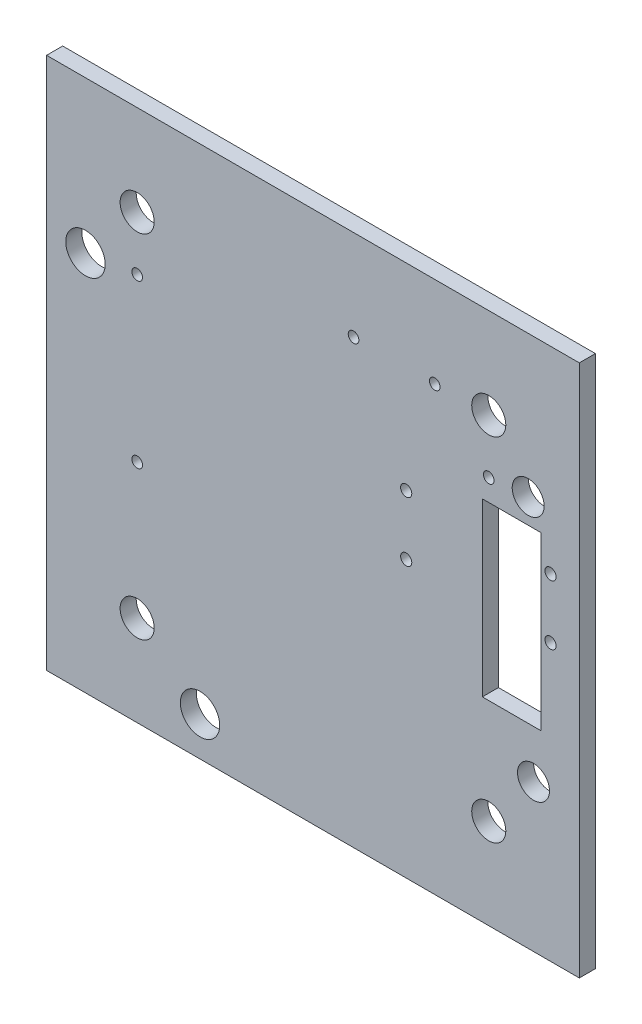
ISO-10303-21;
HEADER;
FILE_DESCRIPTION(('STEP AP214'),'2;1');
FILE_NAME('part.step','',(''),(''),'','','');
FILE_SCHEMA(('AUTOMOTIVE_DESIGN { 1 0 10303 214 1 1 1 1 }'));
ENDSEC;
DATA;
#1=APPLICATION_CONTEXT('core data for automotive mechanical design processes');
#2=APPLICATION_PROTOCOL_DEFINITION('international standard','automotive_design',2000,#1);
#3=PRODUCT_CONTEXT('',#1,'mechanical');
#4=PRODUCT('Part','Part','',(#3));
#5=PRODUCT_RELATED_PRODUCT_CATEGORY('part','',(#4));
#6=PRODUCT_DEFINITION_FORMATION('','',#4);
#7=PRODUCT_DEFINITION_CONTEXT('part definition',#1,'design');
#8=PRODUCT_DEFINITION('design','',#6,#7);
#9=PRODUCT_DEFINITION_SHAPE('','',#8);
#10=(LENGTH_UNIT() NAMED_UNIT(*) SI_UNIT(.MILLI.,.METRE.));
#11=(NAMED_UNIT(*) PLANE_ANGLE_UNIT() SI_UNIT($,.RADIAN.));
#12=(NAMED_UNIT(*) SI_UNIT($,.STERADIAN.) SOLID_ANGLE_UNIT());
#13=UNCERTAINTY_MEASURE_WITH_UNIT(LENGTH_MEASURE(1.E-05),#10,'distance_accuracy_value','');
#14=(GEOMETRIC_REPRESENTATION_CONTEXT(3) GLOBAL_UNCERTAINTY_ASSIGNED_CONTEXT((#13)) GLOBAL_UNIT_ASSIGNED_CONTEXT((#10,
#11,#12)) REPRESENTATION_CONTEXT('',''));
#15=CARTESIAN_POINT('',(0.,0.,0.));
#16=DIRECTION('',(0.,0.,1.));
#17=DIRECTION('',(1.,0.,0.));
#18=AXIS2_PLACEMENT_3D('',#15,#16,#17);
#19=CARTESIAN_POINT('',(16.244,41.774,-0.046));
#20=DIRECTION('',(0.,0.,-1.));
#21=DIRECTION('',(0.,-1.,0.));
#22=AXIS2_PLACEMENT_3D('',#19,#20,#21);
#23=CYLINDRICAL_SURFACE('',#22,1.6);
#24=CARTESIAN_POINT('',(16.244,41.774,0.));
#25=DIRECTION('',(0.,0.,-1.));
#26=DIRECTION('',(0.,-1.,0.));
#27=AXIS2_PLACEMENT_3D('',#24,#25,#26);
#28=CIRCLE('',#27,1.6);
#29=CARTESIAN_POINT('',(16.244,40.174,0.));
#30=VERTEX_POINT('',#29);
#31=EDGE_CURVE('E366',#30,#30,#28,.T.);
#32=ORIENTED_EDGE('',*,*,#31,.T.);
#33=DIRECTION('',(0.,0.,1.));
#34=VECTOR('',#33,1.);
#35=CARTESIAN_POINT('',(16.244,40.174,-0.046));
#36=LINE('',#35,#34);
#37=CARTESIAN_POINT('',(16.244,40.174,1.51));
#38=VERTEX_POINT('',#37);
#39=EDGE_CURVE('E11',#30,#38,#36,.T.);
#40=ORIENTED_EDGE('',*,*,#39,.T.);
#41=CARTESIAN_POINT('',(16.244,41.774,1.51));
#42=DIRECTION('',(0.,0.,-1.));
#43=DIRECTION('',(0.,-1.,0.));
#44=AXIS2_PLACEMENT_3D('',#41,#42,#43);
#45=CIRCLE('',#44,1.6);
#46=EDGE_CURVE('E334',#38,#38,#45,.T.);
#47=ORIENTED_EDGE('',*,*,#46,.F.);
#48=ORIENTED_EDGE('',*,*,#39,.F.);
#49=EDGE_LOOP('',(#32,#40,#47,#48));
#50=FACE_BOUND('',#49,.T.);
#51=ADVANCED_FACE('F47',(#50),#23,.F.);
#52=CARTESIAN_POINT('',(11.174,41.774,-0.046));
#53=DIRECTION('',(0.,0.,-1.));
#54=DIRECTION('',(0.,-1.,0.));
#55=AXIS2_PLACEMENT_3D('',#52,#53,#54);
#56=CYLINDRICAL_SURFACE('',#55,0.5);
#57=CARTESIAN_POINT('',(11.174,41.774,0.));
#58=DIRECTION('',(0.,0.,-1.));
#59=DIRECTION('',(0.,-1.,0.));
#60=AXIS2_PLACEMENT_3D('',#57,#58,#59);
#61=CIRCLE('',#60,0.5);
#62=CARTESIAN_POINT('',(11.174,41.274,0.));
#63=VERTEX_POINT('',#62);
#64=EDGE_CURVE('E415',#63,#63,#61,.T.);
#65=ORIENTED_EDGE('',*,*,#64,.T.);
#66=DIRECTION('',(0.,0.,1.));
#67=VECTOR('',#66,1.);
#68=CARTESIAN_POINT('',(11.174,41.274,-0.046));
#69=LINE('',#68,#67);
#70=CARTESIAN_POINT('',(11.174,41.274,1.51));
#71=VERTEX_POINT('',#70);
#72=EDGE_CURVE('E56',#63,#71,#69,.T.);
#73=ORIENTED_EDGE('',*,*,#72,.T.);
#74=CARTESIAN_POINT('',(11.174,41.774,1.51));
#75=DIRECTION('',(0.,0.,-1.));
#76=DIRECTION('',(0.,-1.,0.));
#77=AXIS2_PLACEMENT_3D('',#74,#75,#76);
#78=CIRCLE('',#77,0.5);
#79=EDGE_CURVE('E333',#71,#71,#78,.T.);
#80=ORIENTED_EDGE('',*,*,#79,.F.);
#81=ORIENTED_EDGE('',*,*,#72,.F.);
#82=EDGE_LOOP('',(#65,#73,#80,#81));
#83=FACE_BOUND('',#82,.T.);
#84=ADVANCED_FACE('F562',(#83),#56,.F.);
#85=CARTESIAN_POINT('',(19.944,36.974,0.));
#86=DIRECTION('',(0.,0.,-1.));
#87=DIRECTION('',(1.,0.,0.));
#88=AXIS2_PLACEMENT_3D('',#85,#86,#87);
#89=CYLINDRICAL_SURFACE('',#88,1.5);
#90=DIRECTION('',(0.,0.,1.));
#91=VECTOR('',#90,1.);
#92=CARTESIAN_POINT('',(21.444,36.974,0.));
#93=LINE('',#92,#91);
#94=CARTESIAN_POINT('',(21.444,36.974,0.));
#95=VERTEX_POINT('',#94);
#96=CARTESIAN_POINT('',(21.444,36.974,1.51));
#97=VERTEX_POINT('',#96);
#98=EDGE_CURVE('E50',#95,#97,#93,.T.);
#99=ORIENTED_EDGE('',*,*,#98,.T.);
#100=CARTESIAN_POINT('',(19.944,36.974,1.51));
#101=DIRECTION('',(0.,0.,1.));
#102=DIRECTION('',(1.,0.,0.));
#103=AXIS2_PLACEMENT_3D('',#100,#101,#102);
#104=CIRCLE('',#103,1.5);
#105=EDGE_CURVE('E330',#97,#97,#104,.T.);
#106=ORIENTED_EDGE('',*,*,#105,.T.);
#107=ORIENTED_EDGE('',*,*,#98,.F.);
#108=CARTESIAN_POINT('',(19.944,36.974,0.));
#109=DIRECTION('',(0.,0.,1.));
#110=DIRECTION('',(1.,0.,0.));
#111=AXIS2_PLACEMENT_3D('',#108,#109,#110);
#112=CIRCLE('',#111,1.5);
#113=EDGE_CURVE('E411',#95,#95,#112,.T.);
#114=ORIENTED_EDGE('',*,*,#113,.F.);
#115=EDGE_LOOP('',(#99,#106,#107,#114));
#116=FACE_BOUND('',#115,.T.);
#117=ADVANCED_FACE('F566',(#116),#89,.F.);
#118=CARTESIAN_POINT('',(16.244,36.704,-0.046));
#119=DIRECTION('',(0.,0.,-1.));
#120=DIRECTION('',(0.,-1.,0.));
#121=AXIS2_PLACEMENT_3D('',#118,#119,#120);
#122=CYLINDRICAL_SURFACE('',#121,0.5);
#123=CARTESIAN_POINT('',(16.244,36.704,0.));
#124=DIRECTION('',(0.,0.,-1.));
#125=DIRECTION('',(0.,-1.,0.));
#126=AXIS2_PLACEMENT_3D('',#123,#124,#125);
#127=CIRCLE('',#126,0.5);
#128=CARTESIAN_POINT('',(16.244,36.204,0.));
#129=VERTEX_POINT('',#128);
#130=EDGE_CURVE('E408',#129,#129,#127,.T.);
#131=ORIENTED_EDGE('',*,*,#130,.T.);
#132=DIRECTION('',(0.,0.,1.));
#133=VECTOR('',#132,1.);
#134=CARTESIAN_POINT('',(16.244,36.204,-0.046));
#135=LINE('',#134,#133);
#136=CARTESIAN_POINT('',(16.244,36.204,1.51));
#137=VERTEX_POINT('',#136);
#138=EDGE_CURVE('E271',#129,#137,#135,.T.);
#139=ORIENTED_EDGE('',*,*,#138,.T.);
#140=CARTESIAN_POINT('',(16.244,36.704,1.51));
#141=DIRECTION('',(0.,0.,-1.));
#142=DIRECTION('',(0.,-1.,0.));
#143=AXIS2_PLACEMENT_3D('',#140,#141,#142);
#144=CIRCLE('',#143,0.5);
#145=EDGE_CURVE('E327',#137,#137,#144,.T.);
#146=ORIENTED_EDGE('',*,*,#145,.F.);
#147=ORIENTED_EDGE('',*,*,#138,.F.);
#148=EDGE_LOOP('',(#131,#139,#146,#147));
#149=FACE_BOUND('',#148,.T.);
#150=ADVANCED_FACE('F570',(#149),#122,.F.);
#151=CARTESIAN_POINT('',(3.554,41.774,-0.046));
#152=DIRECTION('',(0.,0.,-1.));
#153=DIRECTION('',(0.,-1.,0.));
#154=AXIS2_PLACEMENT_3D('',#151,#152,#153);
#155=CYLINDRICAL_SURFACE('',#154,0.5);
#156=CARTESIAN_POINT('',(3.554,41.774,0.));
#157=DIRECTION('',(0.,0.,-1.));
#158=DIRECTION('',(0.,-1.,0.));
#159=AXIS2_PLACEMENT_3D('',#156,#157,#158);
#160=CIRCLE('',#159,0.5);
#161=CARTESIAN_POINT('',(3.554,41.274,0.));
#162=VERTEX_POINT('',#161);
#163=EDGE_CURVE('E403',#162,#162,#160,.T.);
#164=ORIENTED_EDGE('',*,*,#163,.T.);
#165=DIRECTION('',(0.,0.,1.));
#166=VECTOR('',#165,1.);
#167=CARTESIAN_POINT('',(3.554,41.274,-0.046));
#168=LINE('',#167,#166);
#169=CARTESIAN_POINT('',(3.554,41.274,1.51));
#170=VERTEX_POINT('',#169);
#171=EDGE_CURVE('E269',#162,#170,#168,.T.);
#172=ORIENTED_EDGE('',*,*,#171,.T.);
#173=CARTESIAN_POINT('',(3.554,41.774,1.51));
#174=DIRECTION('',(0.,0.,-1.));
#175=DIRECTION('',(0.,-1.,0.));
#176=AXIS2_PLACEMENT_3D('',#173,#174,#175);
#177=CIRCLE('',#176,0.5);
#178=EDGE_CURVE('E323',#170,#170,#177,.T.);
#179=ORIENTED_EDGE('',*,*,#178,.F.);
#180=ORIENTED_EDGE('',*,*,#171,.F.);
#181=EDGE_LOOP('',(#164,#172,#179,#180));
#182=FACE_BOUND('',#181,.T.);
#183=ADVANCED_FACE('F575',(#182),#155,.F.);
#184=CARTESIAN_POINT('',(21.144,34.674,0.));
#185=DIRECTION('',(0.,-1.,0.));
#186=DIRECTION('',(0.,0.,-1.));
#187=AXIS2_PLACEMENT_3D('',#184,#185,#186);
#188=PLANE('',#187);
#189=DIRECTION('',(0.,0.,1.));
#190=VECTOR('',#189,1.);
#191=CARTESIAN_POINT('',(21.144,34.674,0.));
#192=LINE('',#191,#190);
#193=CARTESIAN_POINT('',(21.144,34.674,0.));
#194=VERTEX_POINT('',#193);
#195=CARTESIAN_POINT('',(21.144,34.674,1.51));
#196=VERTEX_POINT('',#195);
#197=EDGE_CURVE('E268',#194,#196,#192,.T.);
#198=ORIENTED_EDGE('',*,*,#197,.T.);
#199=DIRECTION('',(-1.,0.,0.));
#200=VECTOR('',#199,1.);
#201=CARTESIAN_POINT('',(21.144,34.674,1.51));
#202=LINE('',#201,#200);
#203=CARTESIAN_POINT('',(15.644,34.674,1.51));
#204=VERTEX_POINT('',#203);
#205=EDGE_CURVE('E315',#196,#204,#202,.T.);
#206=ORIENTED_EDGE('',*,*,#205,.T.);
#207=DIRECTION('',(0.,0.,1.));
#208=VECTOR('',#207,1.);
#209=CARTESIAN_POINT('',(15.644,34.674,0.));
#210=LINE('',#209,#208);
#211=CARTESIAN_POINT('',(15.644,34.674,0.));
#212=VERTEX_POINT('',#211);
#213=EDGE_CURVE('E265',#212,#204,#210,.T.);
#214=ORIENTED_EDGE('',*,*,#213,.F.);
#215=DIRECTION('',(-1.,0.,0.));
#216=VECTOR('',#215,1.);
#217=CARTESIAN_POINT('',(21.144,34.674,0.));
#218=LINE('',#217,#216);
#219=EDGE_CURVE('E379',#194,#212,#218,.T.);
#220=ORIENTED_EDGE('',*,*,#219,.F.);
#221=EDGE_LOOP('',(#198,#206,#214,#220));
#222=FACE_BOUND('',#221,.T.);
#223=ADVANCED_FACE('F578',(#222),#188,.T.);
#224=CARTESIAN_POINT('',(21.144,18.574,0.));
#225=DIRECTION('',(-1.,0.,0.));
#226=DIRECTION('',(0.,0.,1.));
#227=AXIS2_PLACEMENT_3D('',#224,#225,#226);
#228=PLANE('',#227);
#229=DIRECTION('',(0.,0.,1.));
#230=VECTOR('',#229,1.);
#231=CARTESIAN_POINT('',(21.144,18.574,0.));
#232=LINE('',#231,#230);
#233=CARTESIAN_POINT('',(21.144,18.574,0.));
#234=VERTEX_POINT('',#233);
#235=CARTESIAN_POINT('',(21.144,18.574,1.51));
#236=VERTEX_POINT('',#235);
#237=EDGE_CURVE('E262',#234,#236,#232,.T.);
#238=ORIENTED_EDGE('',*,*,#237,.T.);
#239=DIRECTION('',(0.,1.,0.));
#240=VECTOR('',#239,1.);
#241=CARTESIAN_POINT('',(21.144,18.574,1.51));
#242=LINE('',#241,#240);
#243=EDGE_CURVE('E319',#236,#196,#242,.T.);
#244=ORIENTED_EDGE('',*,*,#243,.T.);
#245=ORIENTED_EDGE('',*,*,#197,.F.);
#246=DIRECTION('',(0.,1.,0.));
#247=VECTOR('',#246,1.);
#248=CARTESIAN_POINT('',(21.144,18.574,0.));
#249=LINE('',#248,#247);
#250=EDGE_CURVE('E384',#234,#194,#249,.T.);
#251=ORIENTED_EDGE('',*,*,#250,.F.);
#252=EDGE_LOOP('',(#238,#244,#245,#251));
#253=FACE_BOUND('',#252,.T.);
#254=ADVANCED_FACE('F582',(#253),#228,.T.);
#255=CARTESIAN_POINT('',(15.644,34.674,0.));
#256=DIRECTION('',(1.,0.,0.));
#257=DIRECTION('',(0.,1.,0.));
#258=AXIS2_PLACEMENT_3D('',#255,#256,#257);
#259=PLANE('',#258);
#260=ORIENTED_EDGE('',*,*,#213,.T.);
#261=DIRECTION('',(0.,-1.,0.));
#262=VECTOR('',#261,1.);
#263=CARTESIAN_POINT('',(15.644,34.674,1.51));
#264=LINE('',#263,#262);
#265=CARTESIAN_POINT('',(15.644,18.574,1.51));
#266=VERTEX_POINT('',#265);
#267=EDGE_CURVE('E311',#204,#266,#264,.T.);
#268=ORIENTED_EDGE('',*,*,#267,.T.);
#269=DIRECTION('',(0.,0.,1.));
#270=VECTOR('',#269,1.);
#271=CARTESIAN_POINT('',(15.644,18.574,0.));
#272=LINE('',#271,#270);
#273=CARTESIAN_POINT('',(15.644,18.574,0.));
#274=VERTEX_POINT('',#273);
#275=EDGE_CURVE('E251',#274,#266,#272,.T.);
#276=ORIENTED_EDGE('',*,*,#275,.F.);
#277=DIRECTION('',(0.,-1.,0.));
#278=VECTOR('',#277,1.);
#279=CARTESIAN_POINT('',(15.644,34.674,0.));
#280=LINE('',#279,#278);
#281=EDGE_CURVE('E383',#212,#274,#280,.T.);
#282=ORIENTED_EDGE('',*,*,#281,.F.);
#283=EDGE_LOOP('',(#260,#268,#276,#282));
#284=FACE_BOUND('',#283,.T.);
#285=ADVANCED_FACE('F586',(#284),#259,.T.);
#286=CARTESIAN_POINT('',(15.644,18.574,0.));
#287=DIRECTION('',(0.,1.,0.));
#288=DIRECTION('',(1.,0.,0.));
#289=AXIS2_PLACEMENT_3D('',#286,#287,#288);
#290=PLANE('',#289);
#291=ORIENTED_EDGE('',*,*,#275,.T.);
#292=DIRECTION('',(1.,0.,0.));
#293=VECTOR('',#292,1.);
#294=CARTESIAN_POINT('',(15.644,18.574,1.51));
#295=LINE('',#294,#293);
#296=EDGE_CURVE('E307',#266,#236,#295,.T.);
#297=ORIENTED_EDGE('',*,*,#296,.T.);
#298=ORIENTED_EDGE('',*,*,#237,.F.);
#299=DIRECTION('',(1.,0.,0.));
#300=VECTOR('',#299,1.);
#301=CARTESIAN_POINT('',(15.644,18.574,0.));
#302=LINE('',#301,#300);
#303=EDGE_CURVE('E400',#274,#234,#302,.T.);
#304=ORIENTED_EDGE('',*,*,#303,.F.);
#305=EDGE_LOOP('',(#291,#297,#298,#304));
#306=FACE_BOUND('',#305,.T.);
#307=ADVANCED_FACE('F590',(#306),#290,.T.);
#308=CARTESIAN_POINT('',(-16.756,41.774,-0.046));
#309=DIRECTION('',(0.,0.,-1.));
#310=DIRECTION('',(0.,-1.,0.));
#311=AXIS2_PLACEMENT_3D('',#308,#309,#310);
#312=CYLINDRICAL_SURFACE('',#311,1.6);
#313=CARTESIAN_POINT('',(-16.756,41.774,0.));
#314=DIRECTION('',(0.,0.,-1.));
#315=DIRECTION('',(0.,-1.,0.));
#316=AXIS2_PLACEMENT_3D('',#313,#314,#315);
#317=CIRCLE('',#316,1.6);
#318=CARTESIAN_POINT('',(-16.756,40.174,0.));
#319=VERTEX_POINT('',#318);
#320=EDGE_CURVE('E387',#319,#319,#317,.T.);
#321=ORIENTED_EDGE('',*,*,#320,.T.);
#322=DIRECTION('',(0.,0.,1.));
#323=VECTOR('',#322,1.);
#324=CARTESIAN_POINT('',(-16.756,40.174,-0.046));
#325=LINE('',#324,#323);
#326=CARTESIAN_POINT('',(-16.756,40.174,1.51));
#327=VERTEX_POINT('',#326);
#328=EDGE_CURVE('E245',#319,#327,#325,.T.);
#329=ORIENTED_EDGE('',*,*,#328,.T.);
#330=CARTESIAN_POINT('',(-16.756,41.774,1.51));
#331=DIRECTION('',(0.,0.,-1.));
#332=DIRECTION('',(0.,-1.,0.));
#333=AXIS2_PLACEMENT_3D('',#330,#331,#332);
#334=CIRCLE('',#333,1.6);
#335=EDGE_CURVE('E306',#327,#327,#334,.T.);
#336=ORIENTED_EDGE('',*,*,#335,.F.);
#337=ORIENTED_EDGE('',*,*,#328,.F.);
#338=EDGE_LOOP('',(#321,#329,#336,#337));
#339=FACE_BOUND('',#338,.T.);
#340=ADVANCED_FACE('F594',(#339),#312,.F.);
#341=CARTESIAN_POINT('',(-16.756,36.704,-0.046));
#342=DIRECTION('',(0.,0.,-1.));
#343=DIRECTION('',(0.,-1.,0.));
#344=AXIS2_PLACEMENT_3D('',#341,#342,#343);
#345=CYLINDRICAL_SURFACE('',#344,0.5);
#346=CARTESIAN_POINT('',(-16.756,36.704,0.));
#347=DIRECTION('',(0.,0.,-1.));
#348=DIRECTION('',(0.,-1.,0.));
#349=AXIS2_PLACEMENT_3D('',#346,#347,#348);
#350=CIRCLE('',#349,0.5);
#351=CARTESIAN_POINT('',(-16.756,36.204,0.));
#352=VERTEX_POINT('',#351);
#353=EDGE_CURVE('E241',#352,#352,#350,.T.);
#354=ORIENTED_EDGE('',*,*,#353,.T.);
#355=DIRECTION('',(0.,0.,1.));
#356=VECTOR('',#355,1.);
#357=CARTESIAN_POINT('',(-16.756,36.204,-0.046));
#358=LINE('',#357,#356);
#359=CARTESIAN_POINT('',(-16.756,36.204,1.51));
#360=VERTEX_POINT('',#359);
#361=EDGE_CURVE('E238',#352,#360,#358,.T.);
#362=ORIENTED_EDGE('',*,*,#361,.T.);
#363=CARTESIAN_POINT('',(-16.756,36.704,1.51));
#364=DIRECTION('',(0.,0.,-1.));
#365=DIRECTION('',(0.,-1.,0.));
#366=AXIS2_PLACEMENT_3D('',#363,#364,#365);
#367=CIRCLE('',#366,0.5);
#368=EDGE_CURVE('E243',#360,#360,#367,.T.);
#369=ORIENTED_EDGE('',*,*,#368,.F.);
#370=ORIENTED_EDGE('',*,*,#361,.F.);
#371=EDGE_LOOP('',(#354,#362,#369,#370));
#372=FACE_BOUND('',#371,.T.);
#373=ADVANCED_FACE('F239',(#372),#345,.F.);
#374=CARTESIAN_POINT('',(-21.606,36.024,0.));
#375=DIRECTION('',(0.,0.,-1.));
#376=DIRECTION('',(1.,0.,0.));
#377=AXIS2_PLACEMENT_3D('',#374,#375,#376);
#378=CYLINDRICAL_SURFACE('',#377,1.85);
#379=DIRECTION('',(0.,0.,1.));
#380=VECTOR('',#379,1.);
#381=CARTESIAN_POINT('',(-19.756,36.024,0.));
#382=LINE('',#381,#380);
#383=CARTESIAN_POINT('',(-19.756,36.024,0.));
#384=VERTEX_POINT('',#383);
#385=CARTESIAN_POINT('',(-19.756,36.024,1.51));
#386=VERTEX_POINT('',#385);
#387=EDGE_CURVE('E246',#384,#386,#382,.T.);
#388=ORIENTED_EDGE('',*,*,#387,.T.);
#389=CARTESIAN_POINT('',(-21.606,36.024,1.51));
#390=DIRECTION('',(0.,0.,1.));
#391=DIRECTION('',(1.,0.,0.));
#392=AXIS2_PLACEMENT_3D('',#389,#390,#391);
#393=CIRCLE('',#392,1.85);
#394=EDGE_CURVE('E300',#386,#386,#393,.T.);
#395=ORIENTED_EDGE('',*,*,#394,.T.);
#396=ORIENTED_EDGE('',*,*,#387,.F.);
#397=CARTESIAN_POINT('',(-21.606,36.024,0.));
#398=DIRECTION('',(0.,0.,1.));
#399=DIRECTION('',(1.,0.,0.));
#400=AXIS2_PLACEMENT_3D('',#397,#398,#399);
#401=CIRCLE('',#400,1.85);
#402=EDGE_CURVE('E375',#384,#384,#401,.T.);
#403=ORIENTED_EDGE('',*,*,#402,.F.);
#404=EDGE_LOOP('',(#388,#395,#396,#403));
#405=FACE_BOUND('',#404,.T.);
#406=ADVANCED_FACE('F601',(#405),#378,.F.);
#407=CARTESIAN_POINT('',(20.444,14.074,0.));
#408=DIRECTION('',(0.,0.,-1.));
#409=DIRECTION('',(1.,0.,0.));
#410=AXIS2_PLACEMENT_3D('',#407,#408,#409);
#411=CYLINDRICAL_SURFACE('',#410,1.5);
#412=DIRECTION('',(0.,0.,1.));
#413=VECTOR('',#412,1.);
#414=CARTESIAN_POINT('',(21.944,14.074,0.));
#415=LINE('',#414,#413);
#416=CARTESIAN_POINT('',(21.944,14.074,0.));
#417=VERTEX_POINT('',#416);
#418=CARTESIAN_POINT('',(21.944,14.074,1.51));
#419=VERTEX_POINT('',#418);
#420=EDGE_CURVE('E254',#417,#419,#415,.T.);
#421=ORIENTED_EDGE('',*,*,#420,.T.);
#422=CARTESIAN_POINT('',(20.444,14.074,1.51));
#423=DIRECTION('',(0.,0.,1.));
#424=DIRECTION('',(1.,0.,0.));
#425=AXIS2_PLACEMENT_3D('',#422,#423,#424);
#426=CIRCLE('',#425,1.5);
#427=EDGE_CURVE('E299',#419,#419,#426,.T.);
#428=ORIENTED_EDGE('',*,*,#427,.T.);
#429=ORIENTED_EDGE('',*,*,#420,.F.);
#430=CARTESIAN_POINT('',(20.444,14.074,0.));
#431=DIRECTION('',(0.,0.,1.));
#432=DIRECTION('',(1.,0.,0.));
#433=AXIS2_PLACEMENT_3D('',#430,#431,#432);
#434=CIRCLE('',#433,1.5);
#435=EDGE_CURVE('E370',#417,#417,#434,.T.);
#436=ORIENTED_EDGE('',*,*,#435,.F.);
#437=EDGE_LOOP('',(#421,#428,#429,#436));
#438=FACE_BOUND('',#437,.T.);
#439=ADVANCED_FACE('F539',(#438),#411,.F.);
#440=CARTESIAN_POINT('',(16.244,8.774,-0.046));
#441=DIRECTION('',(0.,0.,-1.));
#442=DIRECTION('',(0.,-1.,0.));
#443=AXIS2_PLACEMENT_3D('',#440,#441,#442);
#444=CYLINDRICAL_SURFACE('',#443,1.6);
#445=CARTESIAN_POINT('',(16.244,8.774,0.));
#446=DIRECTION('',(0.,0.,-1.));
#447=DIRECTION('',(0.,-1.,0.));
#448=AXIS2_PLACEMENT_3D('',#445,#446,#447);
#449=CIRCLE('',#448,1.6);
#450=CARTESIAN_POINT('',(16.244,7.174,0.));
#451=VERTEX_POINT('',#450);
#452=EDGE_CURVE('E367',#451,#451,#449,.T.);
#453=ORIENTED_EDGE('',*,*,#452,.T.);
#454=DIRECTION('',(0.,0.,1.));
#455=VECTOR('',#454,1.);
#456=CARTESIAN_POINT('',(16.244,7.174,-0.046));
#457=LINE('',#456,#455);
#458=CARTESIAN_POINT('',(16.244,7.174,1.51));
#459=VERTEX_POINT('',#458);
#460=EDGE_CURVE('E345',#451,#459,#457,.T.);
#461=ORIENTED_EDGE('',*,*,#460,.T.);
#462=CARTESIAN_POINT('',(16.244,8.774,1.51));
#463=DIRECTION('',(0.,0.,-1.));
#464=DIRECTION('',(0.,-1.,0.));
#465=AXIS2_PLACEMENT_3D('',#462,#463,#464);
#466=CIRCLE('',#465,1.6);
#467=EDGE_CURVE('E295',#459,#459,#466,.T.);
#468=ORIENTED_EDGE('',*,*,#467,.F.);
#469=ORIENTED_EDGE('',*,*,#460,.F.);
#470=EDGE_LOOP('',(#453,#461,#468,#469));
#471=FACE_BOUND('',#470,.T.);
#472=ADVANCED_FACE('F604',(#471),#444,.F.);
#473=CARTESIAN_POINT('',(-16.756,21.4615,-0.046));
#474=DIRECTION('',(0.,0.,-1.));
#475=DIRECTION('',(0.,-1.,0.));
#476=AXIS2_PLACEMENT_3D('',#473,#474,#475);
#477=CYLINDRICAL_SURFACE('',#476,0.5);
#478=CARTESIAN_POINT('',(-16.756,21.4615,0.));
#479=DIRECTION('',(0.,0.,-1.));
#480=DIRECTION('',(0.,-1.,0.));
#481=AXIS2_PLACEMENT_3D('',#478,#479,#480);
#482=CIRCLE('',#481,0.5);
#483=CARTESIAN_POINT('',(-16.756,20.9615,0.));
#484=VERTEX_POINT('',#483);
#485=EDGE_CURVE('E371',#484,#484,#482,.T.);
#486=ORIENTED_EDGE('',*,*,#485,.T.);
#487=DIRECTION('',(0.,0.,1.));
#488=VECTOR('',#487,1.);
#489=CARTESIAN_POINT('',(-16.756,20.9615,-0.046));
#490=LINE('',#489,#488);
#491=CARTESIAN_POINT('',(-16.756,20.9615,1.51));
#492=VERTEX_POINT('',#491);
#493=EDGE_CURVE('E257',#484,#492,#490,.T.);
#494=ORIENTED_EDGE('',*,*,#493,.T.);
#495=CARTESIAN_POINT('',(-16.756,21.4615,1.51));
#496=DIRECTION('',(0.,0.,-1.));
#497=DIRECTION('',(0.,-1.,0.));
#498=AXIS2_PLACEMENT_3D('',#495,#496,#497);
#499=CIRCLE('',#498,0.5);
#500=EDGE_CURVE('E292',#492,#492,#499,.T.);
#501=ORIENTED_EDGE('',*,*,#500,.F.);
#502=ORIENTED_EDGE('',*,*,#493,.F.);
#503=EDGE_LOOP('',(#486,#494,#501,#502));
#504=FACE_BOUND('',#503,.T.);
#505=ADVANCED_FACE('F607',(#504),#477,.F.);
#506=CARTESIAN_POINT('',(-10.856,3.924,0.));
#507=DIRECTION('',(0.,0.,-1.));
#508=DIRECTION('',(1.,0.,0.));
#509=AXIS2_PLACEMENT_3D('',#506,#507,#508);
#510=CYLINDRICAL_SURFACE('',#509,1.85);
#511=DIRECTION('',(0.,0.,1.));
#512=VECTOR('',#511,1.);
#513=CARTESIAN_POINT('',(-9.006,3.924,0.));
#514=LINE('',#513,#512);
#515=CARTESIAN_POINT('',(-9.006,3.924,0.));
#516=VERTEX_POINT('',#515);
#517=CARTESIAN_POINT('',(-9.006,3.924,1.51));
#518=VERTEX_POINT('',#517);
#519=EDGE_CURVE('E339',#516,#518,#514,.T.);
#520=ORIENTED_EDGE('',*,*,#519,.T.);
#521=CARTESIAN_POINT('',(-10.856,3.924,1.51));
#522=DIRECTION('',(0.,0.,1.));
#523=DIRECTION('',(1.,0.,0.));
#524=AXIS2_PLACEMENT_3D('',#521,#522,#523);
#525=CIRCLE('',#524,1.85);
#526=EDGE_CURVE('E291',#518,#518,#525,.T.);
#527=ORIENTED_EDGE('',*,*,#526,.T.);
#528=ORIENTED_EDGE('',*,*,#519,.F.);
#529=CARTESIAN_POINT('',(-10.856,3.924,0.));
#530=DIRECTION('',(0.,0.,1.));
#531=DIRECTION('',(1.,0.,0.));
#532=AXIS2_PLACEMENT_3D('',#529,#530,#531);
#533=CIRCLE('',#532,1.85);
#534=EDGE_CURVE('E454',#516,#516,#533,.T.);
#535=ORIENTED_EDGE('',*,*,#534,.F.);
#536=EDGE_LOOP('',(#520,#527,#528,#535));
#537=FACE_BOUND('',#536,.T.);
#538=ADVANCED_FACE('F558',(#537),#510,.F.);
#539=CARTESIAN_POINT('',(-16.756,8.774,-0.046));
#540=DIRECTION('',(0.,0.,-1.));
#541=DIRECTION('',(0.,-1.,0.));
#542=AXIS2_PLACEMENT_3D('',#539,#540,#541);
#543=CYLINDRICAL_SURFACE('',#542,1.6);
#544=CARTESIAN_POINT('',(-16.756,8.774,0.));
#545=DIRECTION('',(0.,0.,-1.));
#546=DIRECTION('',(0.,-1.,0.));
#547=AXIS2_PLACEMENT_3D('',#544,#545,#546);
#548=CIRCLE('',#547,1.6);
#549=CARTESIAN_POINT('',(-16.756,7.174,0.));
#550=VERTEX_POINT('',#549);
#551=EDGE_CURVE('E362',#550,#550,#548,.T.);
#552=ORIENTED_EDGE('',*,*,#551,.T.);
#553=DIRECTION('',(0.,0.,1.));
#554=VECTOR('',#553,1.);
#555=CARTESIAN_POINT('',(-16.756,7.174,-0.046));
#556=LINE('',#555,#554);
#557=CARTESIAN_POINT('',(-16.756,7.174,1.51));
#558=VERTEX_POINT('',#557);
#559=EDGE_CURVE('E337',#550,#558,#556,.T.);
#560=ORIENTED_EDGE('',*,*,#559,.T.);
#561=CARTESIAN_POINT('',(-16.756,8.774,1.51));
#562=DIRECTION('',(0.,0.,-1.));
#563=DIRECTION('',(0.,-1.,0.));
#564=AXIS2_PLACEMENT_3D('',#561,#562,#563);
#565=CIRCLE('',#564,1.6);
#566=EDGE_CURVE('E365',#558,#558,#565,.T.);
#567=ORIENTED_EDGE('',*,*,#566,.F.);
#568=ORIENTED_EDGE('',*,*,#559,.F.);
#569=EDGE_LOOP('',(#552,#560,#567,#568));
#570=FACE_BOUND('',#569,.T.);
#571=ADVANCED_FACE('F553',(#570),#543,.F.);
#572=CARTESIAN_POINT('',(-25.256,50.274,0.));
#573=DIRECTION('',(0.,1.,0.));
#574=DIRECTION('',(1.,0.,0.));
#575=AXIS2_PLACEMENT_3D('',#572,#573,#574);
#576=PLANE('',#575);
#577=DIRECTION('',(0.,0.,1.));
#578=VECTOR('',#577,1.);
#579=CARTESIAN_POINT('',(-25.256,50.274,0.));
#580=LINE('',#579,#578);
#581=CARTESIAN_POINT('',(-25.256,50.274,0.));
#582=VERTEX_POINT('',#581);
#583=CARTESIAN_POINT('',(-25.256,50.274,1.51));
#584=VERTEX_POINT('',#583);
#585=EDGE_CURVE('E470',#582,#584,#580,.T.);
#586=ORIENTED_EDGE('',*,*,#585,.T.);
#587=DIRECTION('',(1.,0.,0.));
#588=VECTOR('',#587,1.);
#589=CARTESIAN_POINT('',(-25.256,50.274,1.51));
#590=LINE('',#589,#588);
#591=CARTESIAN_POINT('',(24.744,50.274,1.51));
#592=VERTEX_POINT('',#591);
#593=EDGE_CURVE('E363',#584,#592,#590,.T.);
#594=ORIENTED_EDGE('',*,*,#593,.T.);
#595=DIRECTION('',(0.,0.,1.));
#596=VECTOR('',#595,1.);
#597=CARTESIAN_POINT('',(24.744,50.274,0.));
#598=LINE('',#597,#596);
#599=CARTESIAN_POINT('',(24.744,50.274,0.));
#600=VERTEX_POINT('',#599);
#601=EDGE_CURVE('E500',#600,#592,#598,.T.);
#602=ORIENTED_EDGE('',*,*,#601,.F.);
#603=DIRECTION('',(1.,0.,0.));
#604=VECTOR('',#603,1.);
#605=CARTESIAN_POINT('',(-25.256,50.274,0.));
#606=LINE('',#605,#604);
#607=EDGE_CURVE('E462',#582,#600,#606,.T.);
#608=ORIENTED_EDGE('',*,*,#607,.F.);
#609=EDGE_LOOP('',(#586,#594,#602,#608));
#610=FACE_BOUND('',#609,.T.);
#611=ADVANCED_FACE('F543',(#610),#576,.T.);
#612=CARTESIAN_POINT('',(0.,0.,1.51));
#613=DIRECTION('',(0.,0.,1.));
#614=DIRECTION('',(1.,0.,0.));
#615=AXIS2_PLACEMENT_3D('',#612,#613,#614);
#616=PLANE('',#615);
#617=CARTESIAN_POINT('',(22.044,26.174,1.51));
#618=DIRECTION('',(0.,0.,1.));
#619=DIRECTION('',(1.,0.,0.));
#620=AXIS2_PLACEMENT_3D('',#617,#618,#619);
#621=CIRCLE('',#620,0.524999999999997);
#622=CARTESIAN_POINT('',(22.569,26.174,1.51));
#623=VERTEX_POINT('',#622);
#624=EDGE_CURVE('E666',#623,#623,#621,.T.);
#625=ORIENTED_EDGE('',*,*,#624,.F.);
#626=EDGE_LOOP('',(#625));
#627=FACE_BOUND('',#626,.T.);
#628=CARTESIAN_POINT('',(8.494,26.174,1.51));
#629=DIRECTION('',(0.,0.,1.));
#630=DIRECTION('',(1.,0.,0.));
#631=AXIS2_PLACEMENT_3D('',#628,#629,#630);
#632=CIRCLE('',#631,0.524999999999997);
#633=CARTESIAN_POINT('',(9.01899999999999,26.174,1.51));
#634=VERTEX_POINT('',#633);
#635=EDGE_CURVE('E660',#634,#634,#632,.T.);
#636=ORIENTED_EDGE('',*,*,#635,.F.);
#637=EDGE_LOOP('',(#636));
#638=FACE_BOUND('',#637,.T.);
#639=CARTESIAN_POINT('',(8.494,31.774,1.51));
#640=DIRECTION('',(0.,0.,1.));
#641=DIRECTION('',(1.,0.,0.));
#642=AXIS2_PLACEMENT_3D('',#639,#640,#641);
#643=CIRCLE('',#642,0.524999999999997);
#644=CARTESIAN_POINT('',(9.01899999999999,31.774,1.51));
#645=VERTEX_POINT('',#644);
#646=EDGE_CURVE('E648',#645,#645,#643,.T.);
#647=ORIENTED_EDGE('',*,*,#646,.F.);
#648=EDGE_LOOP('',(#647));
#649=FACE_BOUND('',#648,.T.);
#650=CARTESIAN_POINT('',(22.044,31.774,1.51));
#651=DIRECTION('',(0.,0.,1.));
#652=DIRECTION('',(1.,0.,0.));
#653=AXIS2_PLACEMENT_3D('',#650,#651,#652);
#654=CIRCLE('',#653,0.524999999999997);
#655=CARTESIAN_POINT('',(22.569,31.774,1.51));
#656=VERTEX_POINT('',#655);
#657=EDGE_CURVE('E523',#656,#656,#654,.T.);
#658=ORIENTED_EDGE('',*,*,#657,.F.);
#659=EDGE_LOOP('',(#658));
#660=FACE_BOUND('',#659,.T.);
#661=ORIENTED_EDGE('',*,*,#46,.T.);
#662=EDGE_LOOP('',(#661));
#663=FACE_BOUND('',#662,.T.);
#664=ORIENTED_EDGE('',*,*,#79,.T.);
#665=EDGE_LOOP('',(#664));
#666=FACE_BOUND('',#665,.T.);
#667=ORIENTED_EDGE('',*,*,#105,.F.);
#668=EDGE_LOOP('',(#667));
#669=FACE_BOUND('',#668,.T.);
#670=ORIENTED_EDGE('',*,*,#145,.T.);
#671=EDGE_LOOP('',(#670));
#672=FACE_BOUND('',#671,.T.);
#673=ORIENTED_EDGE('',*,*,#178,.T.);
#674=EDGE_LOOP('',(#673));
#675=FACE_BOUND('',#674,.T.);
#676=ORIENTED_EDGE('',*,*,#296,.F.);
#677=ORIENTED_EDGE('',*,*,#267,.F.);
#678=ORIENTED_EDGE('',*,*,#205,.F.);
#679=ORIENTED_EDGE('',*,*,#243,.F.);
#680=EDGE_LOOP('',(#676,#677,#678,#679));
#681=FACE_BOUND('',#680,.T.);
#682=ORIENTED_EDGE('',*,*,#335,.T.);
#683=EDGE_LOOP('',(#682));
#684=FACE_BOUND('',#683,.T.);
#685=ORIENTED_EDGE('',*,*,#368,.T.);
#686=EDGE_LOOP('',(#685));
#687=FACE_BOUND('',#686,.T.);
#688=ORIENTED_EDGE('',*,*,#394,.F.);
#689=EDGE_LOOP('',(#688));
#690=FACE_BOUND('',#689,.T.);
#691=ORIENTED_EDGE('',*,*,#427,.F.);
#692=EDGE_LOOP('',(#691));
#693=FACE_BOUND('',#692,.T.);
#694=ORIENTED_EDGE('',*,*,#467,.T.);
#695=EDGE_LOOP('',(#694));
#696=FACE_BOUND('',#695,.T.);
#697=ORIENTED_EDGE('',*,*,#500,.T.);
#698=EDGE_LOOP('',(#697));
#699=FACE_BOUND('',#698,.T.);
#700=ORIENTED_EDGE('',*,*,#526,.F.);
#701=EDGE_LOOP('',(#700));
#702=FACE_BOUND('',#701,.T.);
#703=ORIENTED_EDGE('',*,*,#566,.T.);
#704=EDGE_LOOP('',(#703));
#705=FACE_BOUND('',#704,.T.);
#706=DIRECTION('',(-1.,0.,0.));
#707=VECTOR('',#706,1.);
#708=CARTESIAN_POINT('',(24.744,0.274,1.51));
#709=LINE('',#708,#707);
#710=CARTESIAN_POINT('',(24.744,0.274,1.51));
#711=VERTEX_POINT('',#710);
#712=CARTESIAN_POINT('',(-25.256,0.274,1.51));
#713=VERTEX_POINT('',#712);
#714=EDGE_CURVE('E497',#711,#713,#709,.T.);
#715=ORIENTED_EDGE('',*,*,#714,.F.);
#716=DIRECTION('',(0.,-1.,0.));
#717=VECTOR('',#716,1.);
#718=CARTESIAN_POINT('',(24.744,50.274,1.51));
#719=LINE('',#718,#717);
#720=EDGE_CURVE('E504',#592,#711,#719,.T.);
#721=ORIENTED_EDGE('',*,*,#720,.F.);
#722=ORIENTED_EDGE('',*,*,#593,.F.);
#723=DIRECTION('',(0.,1.,0.));
#724=VECTOR('',#723,1.);
#725=CARTESIAN_POINT('',(-25.256,0.274,1.51));
#726=LINE('',#725,#724);
#727=EDGE_CURVE('E474',#713,#584,#726,.T.);
#728=ORIENTED_EDGE('',*,*,#727,.F.);
#729=EDGE_LOOP('',(#715,#721,#722,#728));
#730=FACE_BOUND('',#729,.T.);
#731=ADVANCED_FACE('F429',(#627,#638,#649,#660,#663,#666,#669,#672,#675,#681,#684,#687,#690,
#693,#696,#699,#702,#705,#730),#616,.T.);
#732=CARTESIAN_POINT('',(0.,0.,0.));
#733=DIRECTION('',(0.,0.,1.));
#734=DIRECTION('',(1.,0.,0.));
#735=AXIS2_PLACEMENT_3D('',#732,#733,#734);
#736=PLANE('',#735);
#737=CARTESIAN_POINT('',(22.044,26.174,0.));
#738=DIRECTION('',(0.,0.,1.));
#739=DIRECTION('',(1.,0.,0.));
#740=AXIS2_PLACEMENT_3D('',#737,#738,#739);
#741=CIRCLE('',#740,0.524999999999997);
#742=CARTESIAN_POINT('',(22.569,26.174,0.));
#743=VERTEX_POINT('',#742);
#744=EDGE_CURVE('E663',#743,#743,#741,.T.);
#745=ORIENTED_EDGE('',*,*,#744,.T.);
#746=EDGE_LOOP('',(#745));
#747=FACE_BOUND('',#746,.T.);
#748=CARTESIAN_POINT('',(8.494,26.174,0.));
#749=DIRECTION('',(0.,0.,1.));
#750=DIRECTION('',(1.,0.,0.));
#751=AXIS2_PLACEMENT_3D('',#748,#749,#750);
#752=CIRCLE('',#751,0.524999999999997);
#753=CARTESIAN_POINT('',(9.01899999999999,26.174,0.));
#754=VERTEX_POINT('',#753);
#755=EDGE_CURVE('E655',#754,#754,#752,.T.);
#756=ORIENTED_EDGE('',*,*,#755,.T.);
#757=EDGE_LOOP('',(#756));
#758=FACE_BOUND('',#757,.T.);
#759=CARTESIAN_POINT('',(8.494,31.774,0.));
#760=DIRECTION('',(0.,0.,1.));
#761=DIRECTION('',(1.,0.,0.));
#762=AXIS2_PLACEMENT_3D('',#759,#760,#761);
#763=CIRCLE('',#762,0.524999999999997);
#764=CARTESIAN_POINT('',(9.01899999999999,31.774,0.));
#765=VERTEX_POINT('',#764);
#766=EDGE_CURVE('E651',#765,#765,#763,.T.);
#767=ORIENTED_EDGE('',*,*,#766,.T.);
#768=EDGE_LOOP('',(#767));
#769=FACE_BOUND('',#768,.T.);
#770=CARTESIAN_POINT('',(22.044,31.774,0.));
#771=DIRECTION('',(0.,0.,1.));
#772=DIRECTION('',(1.,0.,0.));
#773=AXIS2_PLACEMENT_3D('',#770,#771,#772);
#774=CIRCLE('',#773,0.524999999999997);
#775=CARTESIAN_POINT('',(22.569,31.774,0.));
#776=VERTEX_POINT('',#775);
#777=EDGE_CURVE('E528',#776,#776,#774,.T.);
#778=ORIENTED_EDGE('',*,*,#777,.T.);
#779=EDGE_LOOP('',(#778));
#780=FACE_BOUND('',#779,.T.);
#781=ORIENTED_EDGE('',*,*,#31,.F.);
#782=EDGE_LOOP('',(#781));
#783=FACE_BOUND('',#782,.T.);
#784=ORIENTED_EDGE('',*,*,#64,.F.);
#785=EDGE_LOOP('',(#784));
#786=FACE_BOUND('',#785,.T.);
#787=ORIENTED_EDGE('',*,*,#113,.T.);
#788=EDGE_LOOP('',(#787));
#789=FACE_BOUND('',#788,.T.);
#790=ORIENTED_EDGE('',*,*,#130,.F.);
#791=EDGE_LOOP('',(#790));
#792=FACE_BOUND('',#791,.T.);
#793=ORIENTED_EDGE('',*,*,#163,.F.);
#794=EDGE_LOOP('',(#793));
#795=FACE_BOUND('',#794,.T.);
#796=ORIENTED_EDGE('',*,*,#250,.T.);
#797=ORIENTED_EDGE('',*,*,#219,.T.);
#798=ORIENTED_EDGE('',*,*,#281,.T.);
#799=ORIENTED_EDGE('',*,*,#303,.T.);
#800=EDGE_LOOP('',(#796,#797,#798,#799));
#801=FACE_BOUND('',#800,.T.);
#802=ORIENTED_EDGE('',*,*,#320,.F.);
#803=EDGE_LOOP('',(#802));
#804=FACE_BOUND('',#803,.T.);
#805=ORIENTED_EDGE('',*,*,#353,.F.);
#806=EDGE_LOOP('',(#805));
#807=FACE_BOUND('',#806,.T.);
#808=ORIENTED_EDGE('',*,*,#402,.T.);
#809=EDGE_LOOP('',(#808));
#810=FACE_BOUND('',#809,.T.);
#811=ORIENTED_EDGE('',*,*,#435,.T.);
#812=EDGE_LOOP('',(#811));
#813=FACE_BOUND('',#812,.T.);
#814=ORIENTED_EDGE('',*,*,#452,.F.);
#815=EDGE_LOOP('',(#814));
#816=FACE_BOUND('',#815,.T.);
#817=ORIENTED_EDGE('',*,*,#485,.F.);
#818=EDGE_LOOP('',(#817));
#819=FACE_BOUND('',#818,.T.);
#820=ORIENTED_EDGE('',*,*,#534,.T.);
#821=EDGE_LOOP('',(#820));
#822=FACE_BOUND('',#821,.T.);
#823=ORIENTED_EDGE('',*,*,#551,.F.);
#824=EDGE_LOOP('',(#823));
#825=FACE_BOUND('',#824,.T.);
#826=DIRECTION('',(0.,1.,0.));
#827=VECTOR('',#826,1.);
#828=CARTESIAN_POINT('',(-25.256,0.274,0.));
#829=LINE('',#828,#827);
#830=CARTESIAN_POINT('',(-25.256,0.274,0.));
#831=VERTEX_POINT('',#830);
#832=EDGE_CURVE('E460',#831,#582,#829,.T.);
#833=ORIENTED_EDGE('',*,*,#832,.T.);
#834=ORIENTED_EDGE('',*,*,#607,.T.);
#835=DIRECTION('',(0.,-1.,0.));
#836=VECTOR('',#835,1.);
#837=CARTESIAN_POINT('',(24.744,50.274,0.));
#838=LINE('',#837,#836);
#839=CARTESIAN_POINT('',(24.744,0.274,0.));
#840=VERTEX_POINT('',#839);
#841=EDGE_CURVE('E481',#600,#840,#838,.T.);
#842=ORIENTED_EDGE('',*,*,#841,.T.);
#843=DIRECTION('',(-1.,0.,0.));
#844=VECTOR('',#843,1.);
#845=CARTESIAN_POINT('',(24.744,0.274,0.));
#846=LINE('',#845,#844);
#847=EDGE_CURVE('E465',#840,#831,#846,.T.);
#848=ORIENTED_EDGE('',*,*,#847,.T.);
#849=EDGE_LOOP('',(#833,#834,#842,#848));
#850=FACE_BOUND('',#849,.T.);
#851=ADVANCED_FACE('F425',(#747,#758,#769,#780,#783,#786,#789,#792,#795,#801,#804,#807,#810,
#813,#816,#819,#822,#825,#850),#736,.F.);
#852=CARTESIAN_POINT('',(-25.256,0.274,0.));
#853=DIRECTION('',(-1.,0.,0.));
#854=DIRECTION('',(0.,0.,1.));
#855=AXIS2_PLACEMENT_3D('',#852,#853,#854);
#856=PLANE('',#855);
#857=DIRECTION('',(0.,0.,1.));
#858=VECTOR('',#857,1.);
#859=CARTESIAN_POINT('',(-25.256,0.274,0.));
#860=LINE('',#859,#858);
#861=EDGE_CURVE('E501',#831,#713,#860,.T.);
#862=ORIENTED_EDGE('',*,*,#861,.T.);
#863=ORIENTED_EDGE('',*,*,#727,.T.);
#864=ORIENTED_EDGE('',*,*,#585,.F.);
#865=ORIENTED_EDGE('',*,*,#832,.F.);
#866=EDGE_LOOP('',(#862,#863,#864,#865));
#867=FACE_BOUND('',#866,.T.);
#868=ADVANCED_FACE('F428',(#867),#856,.T.);
#869=CARTESIAN_POINT('',(24.744,50.274,0.));
#870=DIRECTION('',(1.,0.,0.));
#871=DIRECTION('',(0.,1.,0.));
#872=AXIS2_PLACEMENT_3D('',#869,#870,#871);
#873=PLANE('',#872);
#874=ORIENTED_EDGE('',*,*,#601,.T.);
#875=ORIENTED_EDGE('',*,*,#720,.T.);
#876=DIRECTION('',(0.,0.,1.));
#877=VECTOR('',#876,1.);
#878=CARTESIAN_POINT('',(24.744,0.274,0.));
#879=LINE('',#878,#877);
#880=EDGE_CURVE('E518',#840,#711,#879,.T.);
#881=ORIENTED_EDGE('',*,*,#880,.F.);
#882=ORIENTED_EDGE('',*,*,#841,.F.);
#883=EDGE_LOOP('',(#874,#875,#881,#882));
#884=FACE_BOUND('',#883,.T.);
#885=ADVANCED_FACE('F519',(#884),#873,.T.);
#886=CARTESIAN_POINT('',(24.744,0.274,0.));
#887=DIRECTION('',(0.,-1.,0.));
#888=DIRECTION('',(0.,0.,-1.));
#889=AXIS2_PLACEMENT_3D('',#886,#887,#888);
#890=PLANE('',#889);
#891=ORIENTED_EDGE('',*,*,#880,.T.);
#892=ORIENTED_EDGE('',*,*,#714,.T.);
#893=ORIENTED_EDGE('',*,*,#861,.F.);
#894=ORIENTED_EDGE('',*,*,#847,.F.);
#895=EDGE_LOOP('',(#891,#892,#893,#894));
#896=FACE_BOUND('',#895,.T.);
#897=ADVANCED_FACE('F516',(#896),#890,.T.);
#898=CARTESIAN_POINT('',(22.044,31.774,1.51));
#899=DIRECTION('',(0.,0.,-1.));
#900=DIRECTION('',(-1.,0.,0.));
#901=AXIS2_PLACEMENT_3D('',#898,#899,#900);
#902=CYLINDRICAL_SURFACE('',#901,0.524999999999997);
#903=ORIENTED_EDGE('',*,*,#657,.T.);
#904=EDGE_LOOP('',(#903));
#905=FACE_BOUND('',#904,.T.);
#906=ORIENTED_EDGE('',*,*,#777,.F.);
#907=EDGE_LOOP('',(#906));
#908=FACE_BOUND('',#907,.T.);
#909=ADVANCED_FACE('F627',(#905,#908),#902,.F.);
#910=CARTESIAN_POINT('',(8.494,31.774,1.51));
#911=DIRECTION('',(0.,0.,-1.));
#912=DIRECTION('',(-1.,0.,0.));
#913=AXIS2_PLACEMENT_3D('',#910,#911,#912);
#914=CYLINDRICAL_SURFACE('',#913,0.524999999999997);
#915=ORIENTED_EDGE('',*,*,#646,.T.);
#916=EDGE_LOOP('',(#915));
#917=FACE_BOUND('',#916,.T.);
#918=ORIENTED_EDGE('',*,*,#766,.F.);
#919=EDGE_LOOP('',(#918));
#920=FACE_BOUND('',#919,.T.);
#921=ADVANCED_FACE('F631',(#917,#920),#914,.F.);
#922=CARTESIAN_POINT('',(8.494,26.174,1.51));
#923=DIRECTION('',(0.,0.,-1.));
#924=DIRECTION('',(-1.,0.,0.));
#925=AXIS2_PLACEMENT_3D('',#922,#923,#924);
#926=CYLINDRICAL_SURFACE('',#925,0.524999999999997);
#927=ORIENTED_EDGE('',*,*,#635,.T.);
#928=EDGE_LOOP('',(#927));
#929=FACE_BOUND('',#928,.T.);
#930=ORIENTED_EDGE('',*,*,#755,.F.);
#931=EDGE_LOOP('',(#930));
#932=FACE_BOUND('',#931,.T.);
#933=ADVANCED_FACE('F636',(#929,#932),#926,.F.);
#934=CARTESIAN_POINT('',(22.044,26.174,1.51));
#935=DIRECTION('',(0.,0.,-1.));
#936=DIRECTION('',(-1.,0.,0.));
#937=AXIS2_PLACEMENT_3D('',#934,#935,#936);
#938=CYLINDRICAL_SURFACE('',#937,0.524999999999997);
#939=ORIENTED_EDGE('',*,*,#624,.T.);
#940=EDGE_LOOP('',(#939));
#941=FACE_BOUND('',#940,.T.);
#942=ORIENTED_EDGE('',*,*,#744,.F.);
#943=EDGE_LOOP('',(#942));
#944=FACE_BOUND('',#943,.T.);
#945=ADVANCED_FACE('F633',(#941,#944),#938,.F.);
#946=CLOSED_SHELL('',(#51,#84,#117,#150,#183,#223,#254,#285,#307,#340,#373,#406,#439,#472,#505,
#538,#571,#611,#731,#851,#868,#885,#897,#909,#921,#933,#945));
#947=MANIFOLD_SOLID_BREP('B2',#946);
#948=ADVANCED_BREP_SHAPE_REPRESENTATION('',(#18,#947),#14);
#949=SHAPE_DEFINITION_REPRESENTATION(#9,#948);
ENDSEC;
END-ISO-10303-21;
